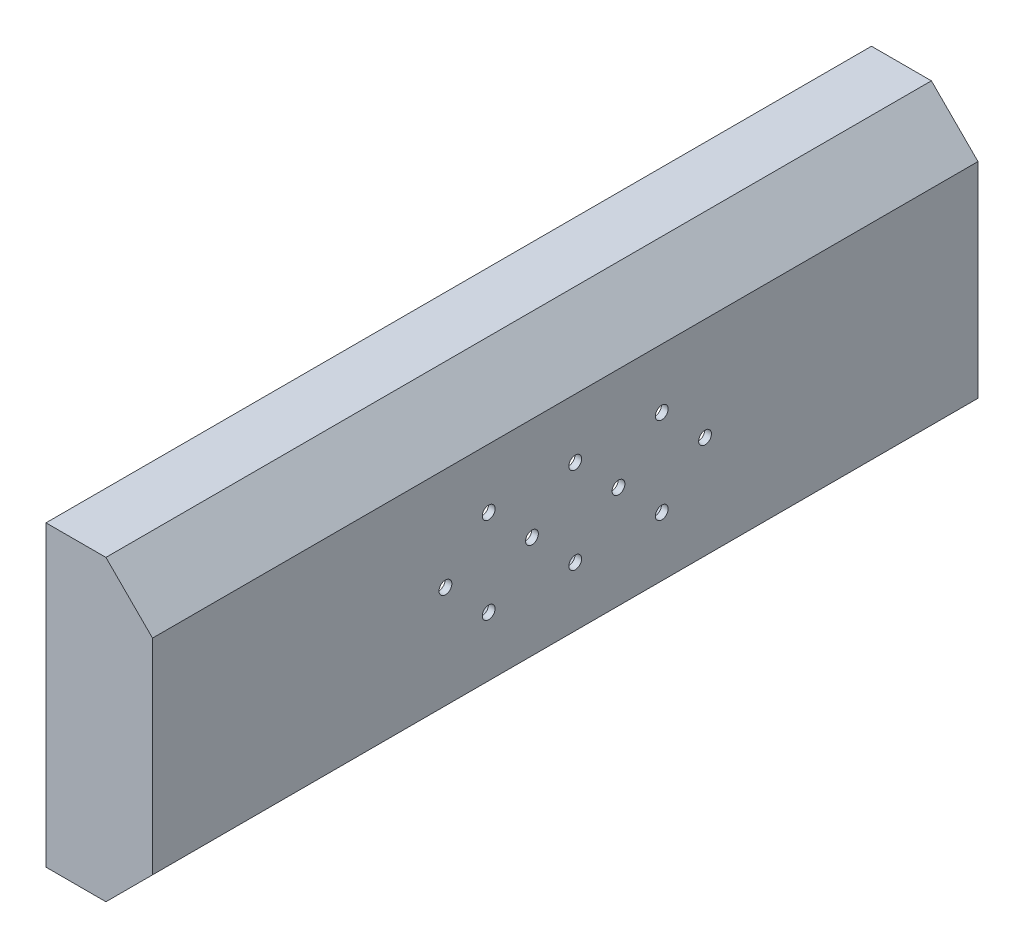
ISO-10303-21;
HEADER;
FILE_DESCRIPTION(('STEP AP214'),'2;1');
FILE_NAME('part.step','',(''),(''),'','','');
FILE_SCHEMA(('AUTOMOTIVE_DESIGN { 1 0 10303 214 1 1 1 1 }'));
ENDSEC;
DATA;
#1=APPLICATION_CONTEXT('core data for automotive mechanical design processes');
#2=APPLICATION_PROTOCOL_DEFINITION('international standard','automotive_design',2000,#1);
#3=PRODUCT_CONTEXT('',#1,'mechanical');
#4=PRODUCT('Part','Part','',(#3));
#5=PRODUCT_RELATED_PRODUCT_CATEGORY('part','',(#4));
#6=PRODUCT_DEFINITION_FORMATION('','',#4);
#7=PRODUCT_DEFINITION_CONTEXT('part definition',#1,'design');
#8=PRODUCT_DEFINITION('design','',#6,#7);
#9=PRODUCT_DEFINITION_SHAPE('','',#8);
#10=(LENGTH_UNIT() NAMED_UNIT(*) SI_UNIT(.MILLI.,.METRE.));
#11=(NAMED_UNIT(*) PLANE_ANGLE_UNIT() SI_UNIT($,.RADIAN.));
#12=(NAMED_UNIT(*) SI_UNIT($,.STERADIAN.) SOLID_ANGLE_UNIT());
#13=UNCERTAINTY_MEASURE_WITH_UNIT(LENGTH_MEASURE(1.E-05),#10,'distance_accuracy_value','');
#14=(GEOMETRIC_REPRESENTATION_CONTEXT(3) GLOBAL_UNCERTAINTY_ASSIGNED_CONTEXT((#13)) GLOBAL_UNIT_ASSIGNED_CONTEXT((#10,
#11,#12)) REPRESENTATION_CONTEXT('',''));
#15=CARTESIAN_POINT('',(0.,0.,0.));
#16=DIRECTION('',(0.,0.,1.));
#17=DIRECTION('',(1.,0.,0.));
#18=AXIS2_PLACEMENT_3D('',#15,#16,#17);
#19=CARTESIAN_POINT('',(0.,56.896,0.));
#20=DIRECTION('',(1.,0.,0.));
#21=DIRECTION('',(0.,0.,-1.));
#22=AXIS2_PLACEMENT_3D('',#19,#20,#21);
#23=PLANE('',#22);
#24=DIRECTION('',(0.,0.,1.));
#25=VECTOR('',#24,1.);
#26=CARTESIAN_POINT('',(0.,0.,0.));
#27=LINE('',#26,#25);
#28=CARTESIAN_POINT('',(0.,0.,-157.48));
#29=VERTEX_POINT('',#28);
#30=CARTESIAN_POINT('',(0.,0.,0.));
#31=VERTEX_POINT('',#30);
#32=EDGE_CURVE('E170',#29,#31,#27,.T.);
#33=ORIENTED_EDGE('',*,*,#32,.T.);
#34=DIRECTION('',(0.,-1.,0.));
#35=VECTOR('',#34,1.);
#36=CARTESIAN_POINT('',(0.,56.896,0.));
#37=LINE('',#36,#35);
#38=CARTESIAN_POINT('',(0.,56.896,0.));
#39=VERTEX_POINT('',#38);
#40=EDGE_CURVE('E204',#39,#31,#37,.T.);
#41=ORIENTED_EDGE('',*,*,#40,.F.);
#42=DIRECTION('',(0.,0.,1.));
#43=VECTOR('',#42,1.);
#44=CARTESIAN_POINT('',(0.,56.896,0.));
#45=LINE('',#44,#43);
#46=CARTESIAN_POINT('',(0.,56.896,-157.48));
#47=VERTEX_POINT('',#46);
#48=EDGE_CURVE('E181',#47,#39,#45,.T.);
#49=ORIENTED_EDGE('',*,*,#48,.F.);
#50=DIRECTION('',(0.,-1.,0.));
#51=VECTOR('',#50,1.);
#52=CARTESIAN_POINT('',(0.,56.896,-157.48));
#53=LINE('',#52,#51);
#54=EDGE_CURVE('E189',#47,#29,#53,.T.);
#55=ORIENTED_EDGE('',*,*,#54,.T.);
#56=EDGE_LOOP('',(#33,#41,#49,#55));
#57=FACE_BOUND('',#56,.T.);
#58=DIRECTION('',(0.,0.,1.));
#59=VECTOR('',#58,1.);
#60=CARTESIAN_POINT('',(0.,1.27,0.));
#61=LINE('',#60,#59);
#62=CARTESIAN_POINT('',(0.,1.27,-156.21));
#63=VERTEX_POINT('',#62);
#64=CARTESIAN_POINT('',(0.,1.27,-1.27));
#65=VERTEX_POINT('',#64);
#66=EDGE_CURVE('E177',#63,#65,#61,.T.);
#67=ORIENTED_EDGE('',*,*,#66,.F.);
#68=DIRECTION('',(0.,-1.,0.));
#69=VECTOR('',#68,1.);
#70=CARTESIAN_POINT('',(0.,56.896,-156.21));
#71=LINE('',#70,#69);
#72=CARTESIAN_POINT('',(0.,55.626,-156.21));
#73=VERTEX_POINT('',#72);
#74=EDGE_CURVE('E160',#73,#63,#71,.T.);
#75=ORIENTED_EDGE('',*,*,#74,.F.);
#76=DIRECTION('',(0.,0.,1.));
#77=VECTOR('',#76,1.);
#78=CARTESIAN_POINT('',(0.,55.626,0.));
#79=LINE('',#78,#77);
#80=CARTESIAN_POINT('',(0.,55.626,-1.27));
#81=VERTEX_POINT('',#80);
#82=EDGE_CURVE('E49',#73,#81,#79,.T.);
#83=ORIENTED_EDGE('',*,*,#82,.T.);
#84=DIRECTION('',(0.,-1.,0.));
#85=VECTOR('',#84,1.);
#86=CARTESIAN_POINT('',(0.,56.896,-1.27));
#87=LINE('',#86,#85);
#88=EDGE_CURVE('E145',#81,#65,#87,.T.);
#89=ORIENTED_EDGE('',*,*,#88,.T.);
#90=EDGE_LOOP('',(#67,#75,#83,#89));
#91=FACE_BOUND('',#90,.T.);
#92=ADVANCED_FACE('F34',(#57,#91),#23,.F.);
#93=CARTESIAN_POINT('',(0.,56.896,0.));
#94=DIRECTION('',(0.,0.,-1.));
#95=DIRECTION('',(-1.,0.,0.));
#96=AXIS2_PLACEMENT_3D('',#93,#94,#95);
#97=PLANE('',#96);
#98=DIRECTION('',(1.,0.,0.));
#99=VECTOR('',#98,1.);
#100=CARTESIAN_POINT('',(0.,0.,0.));
#101=LINE('',#100,#99);
#102=CARTESIAN_POINT('',(11.4299999999998,0.,0.));
#103=VERTEX_POINT('',#102);
#104=EDGE_CURVE('E192',#31,#103,#101,.T.);
#105=ORIENTED_EDGE('',*,*,#104,.T.);
#106=DIRECTION('',(0.707106781186549,0.707106781186546,0.));
#107=VECTOR('',#106,1.);
#108=CARTESIAN_POINT('',(20.3199999999999,8.89000000000002,0.));
#109=LINE('',#108,#107);
#110=CARTESIAN_POINT('',(20.3199999999999,8.89000000000003,0.));
#111=VERTEX_POINT('',#110);
#112=EDGE_CURVE('E42',#103,#111,#109,.T.);
#113=ORIENTED_EDGE('',*,*,#112,.T.);
#114=DIRECTION('',(0.,-1.,0.));
#115=VECTOR('',#114,1.);
#116=CARTESIAN_POINT('',(20.3199999999999,56.896,0.));
#117=LINE('',#116,#115);
#118=CARTESIAN_POINT('',(20.3199999999999,48.006,0.));
#119=VERTEX_POINT('',#118);
#120=EDGE_CURVE('E201',#119,#111,#117,.T.);
#121=ORIENTED_EDGE('',*,*,#120,.F.);
#122=DIRECTION('',(0.707106781186546,-0.707106781186549,0.));
#123=VECTOR('',#122,1.);
#124=CARTESIAN_POINT('',(11.4299999999999,56.896,0.));
#125=LINE('',#124,#123);
#126=CARTESIAN_POINT('',(11.4299999999999,56.896,0.));
#127=VERTEX_POINT('',#126);
#128=EDGE_CURVE('E57',#119,#127,#125,.F.);
#129=ORIENTED_EDGE('',*,*,#128,.T.);
#130=DIRECTION('',(1.,0.,0.));
#131=VECTOR('',#130,1.);
#132=CARTESIAN_POINT('',(0.,56.896,0.));
#133=LINE('',#132,#131);
#134=EDGE_CURVE('E184',#39,#127,#133,.T.);
#135=ORIENTED_EDGE('',*,*,#134,.F.);
#136=ORIENTED_EDGE('',*,*,#40,.T.);
#137=EDGE_LOOP('',(#105,#113,#121,#129,#135,#136));
#138=FACE_BOUND('',#137,.T.);
#139=ADVANCED_FACE('F219',(#138),#97,.F.);
#140=CARTESIAN_POINT('',(20.3199999999999,56.896,0.));
#141=DIRECTION('',(-1.,0.,0.));
#142=DIRECTION('',(0.,0.,1.));
#143=AXIS2_PLACEMENT_3D('',#140,#141,#142);
#144=PLANE('',#143);
#145=CARTESIAN_POINT('',(20.3199999999999,28.448,-55.88));
#146=DIRECTION('',(1.,0.,0.));
#147=DIRECTION('',(0.,0.,-1.));
#148=AXIS2_PLACEMENT_3D('',#145,#146,#147);
#149=CIRCLE('',#148,1.2192);
#150=CARTESIAN_POINT('',(20.3199999999999,28.448,-57.0992));
#151=VERTEX_POINT('',#150);
#152=EDGE_CURVE('E333',#151,#151,#149,.T.);
#153=ORIENTED_EDGE('',*,*,#152,.F.);
#154=EDGE_LOOP('',(#153));
#155=FACE_BOUND('',#154,.T.);
#156=CARTESIAN_POINT('',(20.3199999999999,28.448,-72.39));
#157=DIRECTION('',(1.,0.,0.));
#158=DIRECTION('',(0.,0.,-1.));
#159=AXIS2_PLACEMENT_3D('',#156,#157,#158);
#160=CIRCLE('',#159,1.2192);
#161=CARTESIAN_POINT('',(20.3199999999999,28.448,-73.6092));
#162=VERTEX_POINT('',#161);
#163=EDGE_CURVE('E335',#162,#162,#160,.T.);
#164=ORIENTED_EDGE('',*,*,#163,.F.);
#165=EDGE_LOOP('',(#164));
#166=FACE_BOUND('',#165,.T.);
#167=CARTESIAN_POINT('',(20.32,36.703,-80.645));
#168=DIRECTION('',(1.,0.,0.));
#169=DIRECTION('',(0.,0.,-1.));
#170=AXIS2_PLACEMENT_3D('',#167,#168,#169);
#171=CIRCLE('',#170,1.2192);
#172=CARTESIAN_POINT('',(20.32,36.703,-81.8642));
#173=VERTEX_POINT('',#172);
#174=EDGE_CURVE('E343',#173,#173,#171,.T.);
#175=ORIENTED_EDGE('',*,*,#174,.F.);
#176=EDGE_LOOP('',(#175));
#177=FACE_BOUND('',#176,.T.);
#178=CARTESIAN_POINT('',(20.32,20.193,-80.645));
#179=DIRECTION('',(1.,0.,0.));
#180=DIRECTION('',(0.,0.,-1.));
#181=AXIS2_PLACEMENT_3D('',#178,#179,#180);
#182=CIRCLE('',#181,1.2192);
#183=CARTESIAN_POINT('',(20.32,20.193,-81.8642));
#184=VERTEX_POINT('',#183);
#185=EDGE_CURVE('E349',#184,#184,#182,.T.);
#186=ORIENTED_EDGE('',*,*,#185,.F.);
#187=EDGE_LOOP('',(#186));
#188=FACE_BOUND('',#187,.T.);
#189=CARTESIAN_POINT('',(20.32,28.448,-88.9));
#190=DIRECTION('',(1.,0.,0.));
#191=DIRECTION('',(0.,0.,-1.));
#192=AXIS2_PLACEMENT_3D('',#189,#190,#191);
#193=CIRCLE('',#192,1.2192);
#194=CARTESIAN_POINT('',(20.32,28.448,-90.1192));
#195=VERTEX_POINT('',#194);
#196=EDGE_CURVE('E355',#195,#195,#193,.T.);
#197=ORIENTED_EDGE('',*,*,#196,.F.);
#198=EDGE_LOOP('',(#197));
#199=FACE_BOUND('',#198,.T.);
#200=CARTESIAN_POINT('',(20.32,28.448,-105.41));
#201=DIRECTION('',(1.,0.,0.));
#202=DIRECTION('',(0.,0.,-1.));
#203=AXIS2_PLACEMENT_3D('',#200,#201,#202);
#204=CIRCLE('',#203,1.2192);
#205=CARTESIAN_POINT('',(20.32,28.448,-106.6292));
#206=VERTEX_POINT('',#205);
#207=EDGE_CURVE('E361',#206,#206,#204,.T.);
#208=ORIENTED_EDGE('',*,*,#207,.F.);
#209=EDGE_LOOP('',(#208));
#210=FACE_BOUND('',#209,.T.);
#211=CARTESIAN_POINT('',(20.32,36.703,-97.155));
#212=DIRECTION('',(1.,0.,0.));
#213=DIRECTION('',(0.,0.,-1.));
#214=AXIS2_PLACEMENT_3D('',#211,#212,#213);
#215=CIRCLE('',#214,1.2192);
#216=CARTESIAN_POINT('',(20.32,36.703,-98.3742));
#217=VERTEX_POINT('',#216);
#218=EDGE_CURVE('E367',#217,#217,#215,.T.);
#219=ORIENTED_EDGE('',*,*,#218,.F.);
#220=EDGE_LOOP('',(#219));
#221=FACE_BOUND('',#220,.T.);
#222=CARTESIAN_POINT('',(20.32,20.193,-97.155));
#223=DIRECTION('',(1.,0.,0.));
#224=DIRECTION('',(0.,0.,-1.));
#225=AXIS2_PLACEMENT_3D('',#222,#223,#224);
#226=CIRCLE('',#225,1.2192);
#227=CARTESIAN_POINT('',(20.32,20.193,-98.3742));
#228=VERTEX_POINT('',#227);
#229=EDGE_CURVE('E373',#228,#228,#226,.T.);
#230=ORIENTED_EDGE('',*,*,#229,.F.);
#231=EDGE_LOOP('',(#230));
#232=FACE_BOUND('',#231,.T.);
#233=CARTESIAN_POINT('',(20.3199999999999,36.703,-64.135));
#234=DIRECTION('',(1.,0.,0.));
#235=DIRECTION('',(0.,0.,-1.));
#236=AXIS2_PLACEMENT_3D('',#233,#234,#235);
#237=CIRCLE('',#236,1.2192);
#238=CARTESIAN_POINT('',(20.3199999999999,36.703,-65.3542));
#239=VERTEX_POINT('',#238);
#240=EDGE_CURVE('E379',#239,#239,#237,.T.);
#241=ORIENTED_EDGE('',*,*,#240,.F.);
#242=EDGE_LOOP('',(#241));
#243=FACE_BOUND('',#242,.T.);
#244=CARTESIAN_POINT('',(20.3199999999999,20.193,-64.135));
#245=DIRECTION('',(1.,0.,0.));
#246=DIRECTION('',(0.,0.,-1.));
#247=AXIS2_PLACEMENT_3D('',#244,#245,#246);
#248=CIRCLE('',#247,1.2192);
#249=CARTESIAN_POINT('',(20.3199999999999,20.193,-65.3542));
#250=VERTEX_POINT('',#249);
#251=EDGE_CURVE('E385',#250,#250,#248,.T.);
#252=ORIENTED_EDGE('',*,*,#251,.F.);
#253=EDGE_LOOP('',(#252));
#254=FACE_BOUND('',#253,.T.);
#255=ORIENTED_EDGE('',*,*,#120,.T.);
#256=DIRECTION('',(0.,0.,-1.));
#257=VECTOR('',#256,1.);
#258=CARTESIAN_POINT('',(20.32,8.89000000000002,-157.48));
#259=LINE('',#258,#257);
#260=CARTESIAN_POINT('',(20.32,8.89000000000004,-157.48));
#261=VERTEX_POINT('',#260);
#262=EDGE_CURVE('E209',#111,#261,#259,.T.);
#263=ORIENTED_EDGE('',*,*,#262,.T.);
#264=DIRECTION('',(0.,-1.,0.));
#265=VECTOR('',#264,1.);
#266=CARTESIAN_POINT('',(20.32,56.896,-157.48));
#267=LINE('',#266,#265);
#268=CARTESIAN_POINT('',(20.32,48.006,-157.48));
#269=VERTEX_POINT('',#268);
#270=EDGE_CURVE('E198',#269,#261,#267,.T.);
#271=ORIENTED_EDGE('',*,*,#270,.F.);
#272=DIRECTION('',(0.,0.,1.));
#273=VECTOR('',#272,1.);
#274=CARTESIAN_POINT('',(20.3199999999999,48.006,0.));
#275=LINE('',#274,#273);
#276=EDGE_CURVE('E207',#269,#119,#275,.T.);
#277=ORIENTED_EDGE('',*,*,#276,.T.);
#278=EDGE_LOOP('',(#255,#263,#271,#277));
#279=FACE_BOUND('',#278,.T.);
#280=ADVANCED_FACE('F224',(#155,#166,#177,#188,#199,#210,#221,#232,#243,#254,#279),#144,.F.);
#281=CARTESIAN_POINT('',(0.,56.896,-157.48));
#282=DIRECTION('',(0.,0.,1.));
#283=DIRECTION('',(1.,0.,0.));
#284=AXIS2_PLACEMENT_3D('',#281,#282,#283);
#285=PLANE('',#284);
#286=ORIENTED_EDGE('',*,*,#270,.T.);
#287=DIRECTION('',(-0.707106781186549,-0.707106781186546,0.));
#288=VECTOR('',#287,1.);
#289=CARTESIAN_POINT('',(20.32,8.88999999999997,-157.48));
#290=LINE('',#289,#288);
#291=CARTESIAN_POINT('',(11.43,0.,-157.48));
#292=VERTEX_POINT('',#291);
#293=EDGE_CURVE('E214',#261,#292,#290,.T.);
#294=ORIENTED_EDGE('',*,*,#293,.T.);
#295=DIRECTION('',(-1.,0.,0.));
#296=VECTOR('',#295,1.);
#297=CARTESIAN_POINT('',(0.,0.,-157.48));
#298=LINE('',#297,#296);
#299=EDGE_CURVE('E185',#292,#29,#298,.T.);
#300=ORIENTED_EDGE('',*,*,#299,.T.);
#301=ORIENTED_EDGE('',*,*,#54,.F.);
#302=DIRECTION('',(-1.,0.,0.));
#303=VECTOR('',#302,1.);
#304=CARTESIAN_POINT('',(0.,56.896,-157.48));
#305=LINE('',#304,#303);
#306=CARTESIAN_POINT('',(11.43,56.896,-157.48));
#307=VERTEX_POINT('',#306);
#308=EDGE_CURVE('E187',#307,#47,#305,.T.);
#309=ORIENTED_EDGE('',*,*,#308,.F.);
#310=DIRECTION('',(-0.707106781186546,0.707106781186549,0.));
#311=VECTOR('',#310,1.);
#312=CARTESIAN_POINT('',(11.4299999999999,56.8960000000001,-157.48));
#313=LINE('',#312,#311);
#314=EDGE_CURVE('E212',#307,#269,#313,.F.);
#315=ORIENTED_EDGE('',*,*,#314,.T.);
#316=EDGE_LOOP('',(#286,#294,#300,#301,#309,#315));
#317=FACE_BOUND('',#316,.T.);
#318=ADVANCED_FACE('F230',(#317),#285,.F.);
#319=CARTESIAN_POINT('',(0.,56.896,0.));
#320=DIRECTION('',(0.,-1.,0.));
#321=DIRECTION('',(0.,0.,-1.));
#322=AXIS2_PLACEMENT_3D('',#319,#320,#321);
#323=PLANE('',#322);
#324=ORIENTED_EDGE('',*,*,#134,.T.);
#325=DIRECTION('',(0.,0.,-1.));
#326=VECTOR('',#325,1.);
#327=CARTESIAN_POINT('',(11.4299999999999,56.896,0.));
#328=LINE('',#327,#326);
#329=EDGE_CURVE('E11',#127,#307,#328,.T.);
#330=ORIENTED_EDGE('',*,*,#329,.T.);
#331=ORIENTED_EDGE('',*,*,#308,.T.);
#332=ORIENTED_EDGE('',*,*,#48,.T.);
#333=EDGE_LOOP('',(#324,#330,#331,#332));
#334=FACE_BOUND('',#333,.T.);
#335=ADVANCED_FACE('F241',(#334),#323,.F.);
#336=CARTESIAN_POINT('',(0.,0.,0.));
#337=DIRECTION('',(0.,-1.,0.));
#338=DIRECTION('',(0.,0.,-1.));
#339=AXIS2_PLACEMENT_3D('',#336,#337,#338);
#340=PLANE('',#339);
#341=ORIENTED_EDGE('',*,*,#299,.F.);
#342=DIRECTION('',(0.,0.,1.));
#343=VECTOR('',#342,1.);
#344=CARTESIAN_POINT('',(11.4299999999998,0.,0.));
#345=LINE('',#344,#343);
#346=EDGE_CURVE('E216',#292,#103,#345,.T.);
#347=ORIENTED_EDGE('',*,*,#346,.T.);
#348=ORIENTED_EDGE('',*,*,#104,.F.);
#349=ORIENTED_EDGE('',*,*,#32,.F.);
#350=EDGE_LOOP('',(#341,#347,#348,#349));
#351=FACE_BOUND('',#350,.T.);
#352=ADVANCED_FACE('F234',(#351),#340,.T.);
#353=CARTESIAN_POINT('',(20.3199999999999,8.89000000000002,0.));
#354=DIRECTION('',(0.707106781186546,-0.707106781186549,0.));
#355=DIRECTION('',(0.,0.,1.));
#356=AXIS2_PLACEMENT_3D('',#353,#354,#355);
#357=PLANE('',#356);
#358=ORIENTED_EDGE('',*,*,#112,.F.);
#359=ORIENTED_EDGE('',*,*,#346,.F.);
#360=ORIENTED_EDGE('',*,*,#293,.F.);
#361=ORIENTED_EDGE('',*,*,#262,.F.);
#362=EDGE_LOOP('',(#358,#359,#360,#361));
#363=FACE_BOUND('',#362,.T.);
#364=ADVANCED_FACE('F227',(#363),#357,.T.);
#365=CARTESIAN_POINT('',(11.4299999999999,56.896,0.));
#366=DIRECTION('',(-0.707106781186549,-0.707106781186546,0.));
#367=DIRECTION('',(0.,0.,-1.));
#368=AXIS2_PLACEMENT_3D('',#365,#366,#367);
#369=PLANE('',#368);
#370=ORIENTED_EDGE('',*,*,#128,.F.);
#371=ORIENTED_EDGE('',*,*,#276,.F.);
#372=ORIENTED_EDGE('',*,*,#314,.F.);
#373=ORIENTED_EDGE('',*,*,#329,.F.);
#374=EDGE_LOOP('',(#370,#371,#372,#373));
#375=FACE_BOUND('',#374,.T.);
#376=ADVANCED_FACE('F36',(#375),#369,.F.);
#377=CARTESIAN_POINT('',(0.,56.896,-1.27));
#378=DIRECTION('',(0.,0.,-1.));
#379=DIRECTION('',(-1.,0.,0.));
#380=AXIS2_PLACEMENT_3D('',#377,#378,#379);
#381=PLANE('',#380);
#382=DIRECTION('',(1.,0.,0.));
#383=VECTOR('',#382,1.);
#384=CARTESIAN_POINT('',(0.,1.27,-1.27));
#385=LINE('',#384,#383);
#386=CARTESIAN_POINT('',(10.903948775786,1.27,-1.27));
#387=VERTEX_POINT('',#386);
#388=EDGE_CURVE('E165',#65,#387,#385,.T.);
#389=ORIENTED_EDGE('',*,*,#388,.F.);
#390=ORIENTED_EDGE('',*,*,#88,.F.);
#391=DIRECTION('',(1.,0.,0.));
#392=VECTOR('',#391,1.);
#393=CARTESIAN_POINT('',(0.,55.626,-1.27));
#394=LINE('',#393,#392);
#395=CARTESIAN_POINT('',(10.903948775786,55.626,-1.27));
#396=VERTEX_POINT('',#395);
#397=EDGE_CURVE('E158',#81,#396,#394,.T.);
#398=ORIENTED_EDGE('',*,*,#397,.T.);
#399=DIRECTION('',(0.707106781186546,-0.707106781186549,0.));
#400=VECTOR('',#399,1.);
#401=CARTESIAN_POINT('',(10.531974387893,55.9979743878931,-1.27));
#402=LINE('',#401,#400);
#403=CARTESIAN_POINT('',(19.0499999999999,47.4799487757861,-1.27));
#404=VERTEX_POINT('',#403);
#405=EDGE_CURVE('E136',#404,#396,#402,.F.);
#406=ORIENTED_EDGE('',*,*,#405,.F.);
#407=DIRECTION('',(0.,-1.,0.));
#408=VECTOR('',#407,1.);
#409=CARTESIAN_POINT('',(19.0499999999999,56.896,-1.27));
#410=LINE('',#409,#408);
#411=CARTESIAN_POINT('',(19.0499999999999,9.41605122421385,-1.27));
#412=VERTEX_POINT('',#411);
#413=EDGE_CURVE('E140',#404,#412,#410,.T.);
#414=ORIENTED_EDGE('',*,*,#413,.T.);
#415=DIRECTION('',(0.707106781186549,0.707106781186546,0.));
#416=VECTOR('',#415,1.);
#417=CARTESIAN_POINT('',(19.421974387893,9.78802561210694,-1.27));
#418=LINE('',#417,#416);
#419=EDGE_CURVE('E125',#387,#412,#418,.T.);
#420=ORIENTED_EDGE('',*,*,#419,.F.);
#421=EDGE_LOOP('',(#389,#390,#398,#406,#414,#420));
#422=FACE_BOUND('',#421,.T.);
#423=ADVANCED_FACE('F141',(#422),#381,.T.);
#424=CARTESIAN_POINT('',(19.0499999999999,56.896,0.));
#425=DIRECTION('',(-1.,0.,0.));
#426=DIRECTION('',(0.,0.,1.));
#427=AXIS2_PLACEMENT_3D('',#424,#425,#426);
#428=PLANE('',#427);
#429=CARTESIAN_POINT('',(19.0499999999999,28.448,-55.88));
#430=DIRECTION('',(-1.,0.,0.));
#431=DIRECTION('',(0.,0.,1.));
#432=AXIS2_PLACEMENT_3D('',#429,#430,#431);
#433=CIRCLE('',#432,1.2192);
#434=CARTESIAN_POINT('',(19.0499999999999,28.448,-54.6608));
#435=VERTEX_POINT('',#434);
#436=EDGE_CURVE('E330',#435,#435,#433,.T.);
#437=ORIENTED_EDGE('',*,*,#436,.F.);
#438=EDGE_LOOP('',(#437));
#439=FACE_BOUND('',#438,.T.);
#440=CARTESIAN_POINT('',(19.0499999999999,28.448,-72.39));
#441=DIRECTION('',(-1.,0.,0.));
#442=DIRECTION('',(0.,0.,1.));
#443=AXIS2_PLACEMENT_3D('',#440,#441,#442);
#444=CIRCLE('',#443,1.2192);
#445=CARTESIAN_POINT('',(19.0499999999999,28.448,-71.1708));
#446=VERTEX_POINT('',#445);
#447=EDGE_CURVE('E340',#446,#446,#444,.T.);
#448=ORIENTED_EDGE('',*,*,#447,.F.);
#449=EDGE_LOOP('',(#448));
#450=FACE_BOUND('',#449,.T.);
#451=CARTESIAN_POINT('',(19.0499999999999,36.703,-80.645));
#452=DIRECTION('',(-1.,0.,0.));
#453=DIRECTION('',(0.,0.,1.));
#454=AXIS2_PLACEMENT_3D('',#451,#452,#453);
#455=CIRCLE('',#454,1.2192);
#456=CARTESIAN_POINT('',(19.0499999999999,36.703,-79.4258));
#457=VERTEX_POINT('',#456);
#458=EDGE_CURVE('E346',#457,#457,#455,.T.);
#459=ORIENTED_EDGE('',*,*,#458,.F.);
#460=EDGE_LOOP('',(#459));
#461=FACE_BOUND('',#460,.T.);
#462=CARTESIAN_POINT('',(19.0499999999999,20.193,-80.645));
#463=DIRECTION('',(-1.,0.,0.));
#464=DIRECTION('',(0.,0.,1.));
#465=AXIS2_PLACEMENT_3D('',#462,#463,#464);
#466=CIRCLE('',#465,1.2192);
#467=CARTESIAN_POINT('',(19.0499999999999,20.193,-79.4258));
#468=VERTEX_POINT('',#467);
#469=EDGE_CURVE('E352',#468,#468,#466,.T.);
#470=ORIENTED_EDGE('',*,*,#469,.F.);
#471=EDGE_LOOP('',(#470));
#472=FACE_BOUND('',#471,.T.);
#473=CARTESIAN_POINT('',(19.05,28.448,-88.9));
#474=DIRECTION('',(-1.,0.,0.));
#475=DIRECTION('',(0.,0.,1.));
#476=AXIS2_PLACEMENT_3D('',#473,#474,#475);
#477=CIRCLE('',#476,1.2192);
#478=CARTESIAN_POINT('',(19.05,28.448,-87.6808));
#479=VERTEX_POINT('',#478);
#480=EDGE_CURVE('E358',#479,#479,#477,.T.);
#481=ORIENTED_EDGE('',*,*,#480,.F.);
#482=EDGE_LOOP('',(#481));
#483=FACE_BOUND('',#482,.T.);
#484=CARTESIAN_POINT('',(19.05,28.448,-105.41));
#485=DIRECTION('',(-1.,0.,0.));
#486=DIRECTION('',(0.,0.,1.));
#487=AXIS2_PLACEMENT_3D('',#484,#485,#486);
#488=CIRCLE('',#487,1.2192);
#489=CARTESIAN_POINT('',(19.05,28.448,-104.1908));
#490=VERTEX_POINT('',#489);
#491=EDGE_CURVE('E364',#490,#490,#488,.T.);
#492=ORIENTED_EDGE('',*,*,#491,.F.);
#493=EDGE_LOOP('',(#492));
#494=FACE_BOUND('',#493,.T.);
#495=CARTESIAN_POINT('',(19.05,36.703,-97.155));
#496=DIRECTION('',(-1.,0.,0.));
#497=DIRECTION('',(0.,0.,1.));
#498=AXIS2_PLACEMENT_3D('',#495,#496,#497);
#499=CIRCLE('',#498,1.2192);
#500=CARTESIAN_POINT('',(19.05,36.703,-95.9358));
#501=VERTEX_POINT('',#500);
#502=EDGE_CURVE('E370',#501,#501,#499,.T.);
#503=ORIENTED_EDGE('',*,*,#502,.F.);
#504=EDGE_LOOP('',(#503));
#505=FACE_BOUND('',#504,.T.);
#506=CARTESIAN_POINT('',(19.05,20.193,-97.155));
#507=DIRECTION('',(-1.,0.,0.));
#508=DIRECTION('',(0.,0.,1.));
#509=AXIS2_PLACEMENT_3D('',#506,#507,#508);
#510=CIRCLE('',#509,1.2192);
#511=CARTESIAN_POINT('',(19.05,20.193,-95.9358));
#512=VERTEX_POINT('',#511);
#513=EDGE_CURVE('E376',#512,#512,#510,.T.);
#514=ORIENTED_EDGE('',*,*,#513,.F.);
#515=EDGE_LOOP('',(#514));
#516=FACE_BOUND('',#515,.T.);
#517=CARTESIAN_POINT('',(19.0499999999999,36.703,-64.135));
#518=DIRECTION('',(-1.,0.,0.));
#519=DIRECTION('',(0.,0.,1.));
#520=AXIS2_PLACEMENT_3D('',#517,#518,#519);
#521=CIRCLE('',#520,1.2192);
#522=CARTESIAN_POINT('',(19.0499999999999,36.703,-62.9158));
#523=VERTEX_POINT('',#522);
#524=EDGE_CURVE('E382',#523,#523,#521,.T.);
#525=ORIENTED_EDGE('',*,*,#524,.F.);
#526=EDGE_LOOP('',(#525));
#527=FACE_BOUND('',#526,.T.);
#528=CARTESIAN_POINT('',(19.0499999999999,20.193,-64.135));
#529=DIRECTION('',(-1.,0.,0.));
#530=DIRECTION('',(0.,0.,1.));
#531=AXIS2_PLACEMENT_3D('',#528,#529,#530);
#532=CIRCLE('',#531,1.2192);
#533=CARTESIAN_POINT('',(19.0499999999999,20.193,-62.9158));
#534=VERTEX_POINT('',#533);
#535=EDGE_CURVE('E180',#534,#534,#532,.T.);
#536=ORIENTED_EDGE('',*,*,#535,.F.);
#537=EDGE_LOOP('',(#536));
#538=FACE_BOUND('',#537,.T.);
#539=ORIENTED_EDGE('',*,*,#413,.F.);
#540=DIRECTION('',(0.,0.,-1.));
#541=VECTOR('',#540,1.);
#542=CARTESIAN_POINT('',(19.0499999999999,47.4799487757861,0.));
#543=LINE('',#542,#541);
#544=CARTESIAN_POINT('',(19.05,47.4799487757861,-156.21));
#545=VERTEX_POINT('',#544);
#546=EDGE_CURVE('E151',#545,#404,#543,.F.);
#547=ORIENTED_EDGE('',*,*,#546,.F.);
#548=DIRECTION('',(0.,-1.,0.));
#549=VECTOR('',#548,1.);
#550=CARTESIAN_POINT('',(19.05,56.896,-156.21));
#551=LINE('',#550,#549);
#552=CARTESIAN_POINT('',(19.05,9.41605122421386,-156.21));
#553=VERTEX_POINT('',#552);
#554=EDGE_CURVE('E146',#545,#553,#551,.T.);
#555=ORIENTED_EDGE('',*,*,#554,.T.);
#556=DIRECTION('',(0.,0.,-1.));
#557=VECTOR('',#556,1.);
#558=CARTESIAN_POINT('',(19.0499999999999,9.41605122421386,0.));
#559=LINE('',#558,#557);
#560=EDGE_CURVE('E129',#412,#553,#559,.T.);
#561=ORIENTED_EDGE('',*,*,#560,.F.);
#562=EDGE_LOOP('',(#539,#547,#555,#561));
#563=FACE_BOUND('',#562,.T.);
#564=ADVANCED_FACE('F148',(#439,#450,#461,#472,#483,#494,#505,#516,#527,#538,#563),#428,.T.);
#565=CARTESIAN_POINT('',(0.,56.896,-156.21));
#566=DIRECTION('',(0.,0.,1.));
#567=DIRECTION('',(1.,0.,0.));
#568=AXIS2_PLACEMENT_3D('',#565,#566,#567);
#569=PLANE('',#568);
#570=ORIENTED_EDGE('',*,*,#554,.F.);
#571=DIRECTION('',(-0.707106781186546,0.707106781186549,0.));
#572=VECTOR('',#571,1.);
#573=CARTESIAN_POINT('',(10.531974387893,55.9979743878931,-156.21));
#574=LINE('',#573,#572);
#575=CARTESIAN_POINT('',(10.9039487757861,55.626,-156.21));
#576=VERTEX_POINT('',#575);
#577=EDGE_CURVE('E150',#576,#545,#574,.F.);
#578=ORIENTED_EDGE('',*,*,#577,.F.);
#579=DIRECTION('',(-1.,0.,0.));
#580=VECTOR('',#579,1.);
#581=CARTESIAN_POINT('',(0.,55.626,-156.21));
#582=LINE('',#581,#580);
#583=EDGE_CURVE('E166',#576,#73,#582,.T.);
#584=ORIENTED_EDGE('',*,*,#583,.T.);
#585=ORIENTED_EDGE('',*,*,#74,.T.);
#586=DIRECTION('',(-1.,0.,0.));
#587=VECTOR('',#586,1.);
#588=CARTESIAN_POINT('',(0.,1.27,-156.21));
#589=LINE('',#588,#587);
#590=CARTESIAN_POINT('',(10.9039487757861,1.27,-156.21));
#591=VERTEX_POINT('',#590);
#592=EDGE_CURVE('E163',#591,#63,#589,.T.);
#593=ORIENTED_EDGE('',*,*,#592,.F.);
#594=DIRECTION('',(-0.707106781186549,-0.707106781186546,0.));
#595=VECTOR('',#594,1.);
#596=CARTESIAN_POINT('',(19.421974387893,9.78802561210689,-156.21));
#597=LINE('',#596,#595);
#598=EDGE_CURVE('E153',#553,#591,#597,.T.);
#599=ORIENTED_EDGE('',*,*,#598,.F.);
#600=EDGE_LOOP('',(#570,#578,#584,#585,#593,#599));
#601=FACE_BOUND('',#600,.T.);
#602=ADVANCED_FACE('F280',(#601),#569,.T.);
#603=CARTESIAN_POINT('',(0.,55.626,0.));
#604=DIRECTION('',(0.,-1.,0.));
#605=DIRECTION('',(0.,0.,-1.));
#606=AXIS2_PLACEMENT_3D('',#603,#604,#605);
#607=PLANE('',#606);
#608=ORIENTED_EDGE('',*,*,#397,.F.);
#609=ORIENTED_EDGE('',*,*,#82,.F.);
#610=ORIENTED_EDGE('',*,*,#583,.F.);
#611=DIRECTION('',(0.,0.,1.));
#612=VECTOR('',#611,1.);
#613=CARTESIAN_POINT('',(10.903948775786,55.626,0.));
#614=LINE('',#613,#612);
#615=EDGE_CURVE('E135',#396,#576,#614,.F.);
#616=ORIENTED_EDGE('',*,*,#615,.F.);
#617=EDGE_LOOP('',(#608,#609,#610,#616));
#618=FACE_BOUND('',#617,.T.);
#619=ADVANCED_FACE('F276',(#618),#607,.T.);
#620=CARTESIAN_POINT('',(0.,1.27,0.));
#621=DIRECTION('',(0.,-1.,0.));
#622=DIRECTION('',(0.,0.,-1.));
#623=AXIS2_PLACEMENT_3D('',#620,#621,#622);
#624=PLANE('',#623);
#625=ORIENTED_EDGE('',*,*,#592,.T.);
#626=ORIENTED_EDGE('',*,*,#66,.T.);
#627=ORIENTED_EDGE('',*,*,#388,.T.);
#628=DIRECTION('',(0.,0.,1.));
#629=VECTOR('',#628,1.);
#630=CARTESIAN_POINT('',(10.903948775786,1.27,0.));
#631=LINE('',#630,#629);
#632=EDGE_CURVE('E132',#591,#387,#631,.T.);
#633=ORIENTED_EDGE('',*,*,#632,.F.);
#634=EDGE_LOOP('',(#625,#626,#627,#633));
#635=FACE_BOUND('',#634,.T.);
#636=ADVANCED_FACE('F273',(#635),#624,.F.);
#637=CARTESIAN_POINT('',(19.421974387893,9.78802561210694,0.));
#638=DIRECTION('',(0.707106781186546,-0.707106781186549,0.));
#639=DIRECTION('',(0.,0.,1.));
#640=AXIS2_PLACEMENT_3D('',#637,#638,#639);
#641=PLANE('',#640);
#642=ORIENTED_EDGE('',*,*,#419,.T.);
#643=ORIENTED_EDGE('',*,*,#560,.T.);
#644=ORIENTED_EDGE('',*,*,#598,.T.);
#645=ORIENTED_EDGE('',*,*,#632,.T.);
#646=EDGE_LOOP('',(#642,#643,#644,#645));
#647=FACE_BOUND('',#646,.T.);
#648=ADVANCED_FACE('F127',(#647),#641,.F.);
#649=CARTESIAN_POINT('',(10.531974387893,55.9979743878931,0.));
#650=DIRECTION('',(-0.707106781186549,-0.707106781186546,0.));
#651=DIRECTION('',(0.,0.,-1.));
#652=AXIS2_PLACEMENT_3D('',#649,#650,#651);
#653=PLANE('',#652);
#654=ORIENTED_EDGE('',*,*,#405,.T.);
#655=ORIENTED_EDGE('',*,*,#615,.T.);
#656=ORIENTED_EDGE('',*,*,#577,.T.);
#657=ORIENTED_EDGE('',*,*,#546,.T.);
#658=EDGE_LOOP('',(#654,#655,#656,#657));
#659=FACE_BOUND('',#658,.T.);
#660=ADVANCED_FACE('F266',(#659),#653,.T.);
#661=CARTESIAN_POINT('',(20.3199999999999,20.193,-64.135));
#662=DIRECTION('',(1.,0.,0.));
#663=DIRECTION('',(0.,0.,-1.));
#664=AXIS2_PLACEMENT_3D('',#661,#662,#663);
#665=CYLINDRICAL_SURFACE('',#664,1.2192);
#666=ORIENTED_EDGE('',*,*,#535,.T.);
#667=EDGE_LOOP('',(#666));
#668=FACE_BOUND('',#667,.T.);
#669=ORIENTED_EDGE('',*,*,#251,.T.);
#670=EDGE_LOOP('',(#669));
#671=FACE_BOUND('',#670,.T.);
#672=ADVANCED_FACE('F269',(#668,#671),#665,.F.);
#673=CARTESIAN_POINT('',(20.3199999999999,36.703,-64.135));
#674=DIRECTION('',(1.,0.,0.));
#675=DIRECTION('',(0.,0.,-1.));
#676=AXIS2_PLACEMENT_3D('',#673,#674,#675);
#677=CYLINDRICAL_SURFACE('',#676,1.2192);
#678=ORIENTED_EDGE('',*,*,#524,.T.);
#679=EDGE_LOOP('',(#678));
#680=FACE_BOUND('',#679,.T.);
#681=ORIENTED_EDGE('',*,*,#240,.T.);
#682=EDGE_LOOP('',(#681));
#683=FACE_BOUND('',#682,.T.);
#684=ADVANCED_FACE('F289',(#680,#683),#677,.F.);
#685=CARTESIAN_POINT('',(20.32,20.193,-97.155));
#686=DIRECTION('',(1.,0.,0.));
#687=DIRECTION('',(0.,0.,-1.));
#688=AXIS2_PLACEMENT_3D('',#685,#686,#687);
#689=CYLINDRICAL_SURFACE('',#688,1.2192);
#690=ORIENTED_EDGE('',*,*,#513,.T.);
#691=EDGE_LOOP('',(#690));
#692=FACE_BOUND('',#691,.T.);
#693=ORIENTED_EDGE('',*,*,#229,.T.);
#694=EDGE_LOOP('',(#693));
#695=FACE_BOUND('',#694,.T.);
#696=ADVANCED_FACE('F293',(#692,#695),#689,.F.);
#697=CARTESIAN_POINT('',(20.32,36.703,-97.155));
#698=DIRECTION('',(1.,0.,0.));
#699=DIRECTION('',(0.,0.,-1.));
#700=AXIS2_PLACEMENT_3D('',#697,#698,#699);
#701=CYLINDRICAL_SURFACE('',#700,1.2192);
#702=ORIENTED_EDGE('',*,*,#502,.T.);
#703=EDGE_LOOP('',(#702));
#704=FACE_BOUND('',#703,.T.);
#705=ORIENTED_EDGE('',*,*,#218,.T.);
#706=EDGE_LOOP('',(#705));
#707=FACE_BOUND('',#706,.T.);
#708=ADVANCED_FACE('F297',(#704,#707),#701,.F.);
#709=CARTESIAN_POINT('',(20.32,28.448,-105.41));
#710=DIRECTION('',(1.,0.,0.));
#711=DIRECTION('',(0.,0.,-1.));
#712=AXIS2_PLACEMENT_3D('',#709,#710,#711);
#713=CYLINDRICAL_SURFACE('',#712,1.2192);
#714=ORIENTED_EDGE('',*,*,#491,.T.);
#715=EDGE_LOOP('',(#714));
#716=FACE_BOUND('',#715,.T.);
#717=ORIENTED_EDGE('',*,*,#207,.T.);
#718=EDGE_LOOP('',(#717));
#719=FACE_BOUND('',#718,.T.);
#720=ADVANCED_FACE('F301',(#716,#719),#713,.F.);
#721=CARTESIAN_POINT('',(20.32,28.448,-88.9));
#722=DIRECTION('',(1.,0.,0.));
#723=DIRECTION('',(0.,0.,-1.));
#724=AXIS2_PLACEMENT_3D('',#721,#722,#723);
#725=CYLINDRICAL_SURFACE('',#724,1.2192);
#726=ORIENTED_EDGE('',*,*,#480,.T.);
#727=EDGE_LOOP('',(#726));
#728=FACE_BOUND('',#727,.T.);
#729=ORIENTED_EDGE('',*,*,#196,.T.);
#730=EDGE_LOOP('',(#729));
#731=FACE_BOUND('',#730,.T.);
#732=ADVANCED_FACE('F305',(#728,#731),#725,.F.);
#733=CARTESIAN_POINT('',(20.32,20.193,-80.645));
#734=DIRECTION('',(1.,0.,0.));
#735=DIRECTION('',(0.,0.,-1.));
#736=AXIS2_PLACEMENT_3D('',#733,#734,#735);
#737=CYLINDRICAL_SURFACE('',#736,1.2192);
#738=ORIENTED_EDGE('',*,*,#469,.T.);
#739=EDGE_LOOP('',(#738));
#740=FACE_BOUND('',#739,.T.);
#741=ORIENTED_EDGE('',*,*,#185,.T.);
#742=EDGE_LOOP('',(#741));
#743=FACE_BOUND('',#742,.T.);
#744=ADVANCED_FACE('F309',(#740,#743),#737,.F.);
#745=CARTESIAN_POINT('',(20.32,36.703,-80.645));
#746=DIRECTION('',(1.,0.,0.));
#747=DIRECTION('',(0.,0.,-1.));
#748=AXIS2_PLACEMENT_3D('',#745,#746,#747);
#749=CYLINDRICAL_SURFACE('',#748,1.2192);
#750=ORIENTED_EDGE('',*,*,#458,.T.);
#751=EDGE_LOOP('',(#750));
#752=FACE_BOUND('',#751,.T.);
#753=ORIENTED_EDGE('',*,*,#174,.T.);
#754=EDGE_LOOP('',(#753));
#755=FACE_BOUND('',#754,.T.);
#756=ADVANCED_FACE('F313',(#752,#755),#749,.F.);
#757=CARTESIAN_POINT('',(20.3199999999999,28.448,-72.39));
#758=DIRECTION('',(1.,0.,0.));
#759=DIRECTION('',(0.,0.,-1.));
#760=AXIS2_PLACEMENT_3D('',#757,#758,#759);
#761=CYLINDRICAL_SURFACE('',#760,1.2192);
#762=ORIENTED_EDGE('',*,*,#447,.T.);
#763=EDGE_LOOP('',(#762));
#764=FACE_BOUND('',#763,.T.);
#765=ORIENTED_EDGE('',*,*,#163,.T.);
#766=EDGE_LOOP('',(#765));
#767=FACE_BOUND('',#766,.T.);
#768=ADVANCED_FACE('F317',(#764,#767),#761,.F.);
#769=CARTESIAN_POINT('',(20.3199999999999,28.448,-55.88));
#770=DIRECTION('',(1.,0.,0.));
#771=DIRECTION('',(0.,0.,-1.));
#772=AXIS2_PLACEMENT_3D('',#769,#770,#771);
#773=CYLINDRICAL_SURFACE('',#772,1.2192);
#774=ORIENTED_EDGE('',*,*,#436,.T.);
#775=EDGE_LOOP('',(#774));
#776=FACE_BOUND('',#775,.T.);
#777=ORIENTED_EDGE('',*,*,#152,.T.);
#778=EDGE_LOOP('',(#777));
#779=FACE_BOUND('',#778,.T.);
#780=ADVANCED_FACE('F321',(#776,#779),#773,.F.);
#781=CLOSED_SHELL('',(#92,#139,#280,#318,#335,#352,#364,#376,#423,#564,#602,#619,#636,#648,#660,
#672,#684,#696,#708,#720,#732,#744,#756,#768,#780));
#782=MANIFOLD_SOLID_BREP('B2',#781);
#783=ADVANCED_BREP_SHAPE_REPRESENTATION('',(#18,#782),#14);
#784=SHAPE_DEFINITION_REPRESENTATION(#9,#783);
ENDSEC;
END-ISO-10303-21;
